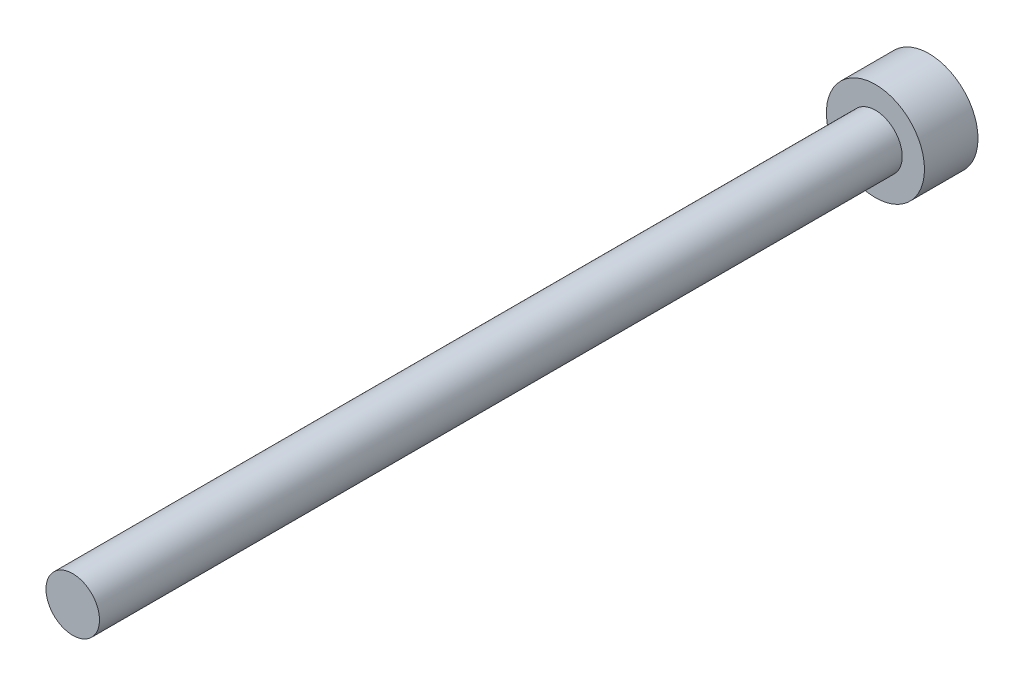
ISO-10303-21;
HEADER;
FILE_DESCRIPTION(('STEP AP214'),'2;1');
FILE_NAME('part.step','',(''),(''),'','','');
FILE_SCHEMA(('AUTOMOTIVE_DESIGN { 1 0 10303 214 1 1 1 1 }'));
ENDSEC;
DATA;
#1=APPLICATION_CONTEXT('core data for automotive mechanical design processes');
#2=APPLICATION_PROTOCOL_DEFINITION('international standard','automotive_design',2000,#1);
#3=PRODUCT_CONTEXT('',#1,'mechanical');
#4=PRODUCT('Part','Part','',(#3));
#5=PRODUCT_RELATED_PRODUCT_CATEGORY('part','',(#4));
#6=PRODUCT_DEFINITION_FORMATION('','',#4);
#7=PRODUCT_DEFINITION_CONTEXT('part definition',#1,'design');
#8=PRODUCT_DEFINITION('design','',#6,#7);
#9=PRODUCT_DEFINITION_SHAPE('','',#8);
#10=(LENGTH_UNIT() NAMED_UNIT(*) SI_UNIT(.MILLI.,.METRE.));
#11=(NAMED_UNIT(*) PLANE_ANGLE_UNIT() SI_UNIT($,.RADIAN.));
#12=(NAMED_UNIT(*) SI_UNIT($,.STERADIAN.) SOLID_ANGLE_UNIT());
#13=UNCERTAINTY_MEASURE_WITH_UNIT(LENGTH_MEASURE(1.E-05),#10,'distance_accuracy_value','');
#14=(GEOMETRIC_REPRESENTATION_CONTEXT(3) GLOBAL_UNCERTAINTY_ASSIGNED_CONTEXT((#13)) GLOBAL_UNIT_ASSIGNED_CONTEXT((#10,
#11,#12)) REPRESENTATION_CONTEXT('',''));
#15=CARTESIAN_POINT('',(0.,0.,0.));
#16=DIRECTION('',(0.,0.,1.));
#17=DIRECTION('',(1.,0.,0.));
#18=AXIS2_PLACEMENT_3D('',#15,#16,#17);
#19=CARTESIAN_POINT('',(0.,0.,-3.));
#20=DIRECTION('',(0.,0.,1.));
#21=DIRECTION('',(1.,0.,0.));
#22=AXIS2_PLACEMENT_3D('',#19,#20,#21);
#23=PLANE('',#22);
#24=CARTESIAN_POINT('',(0.,0.,-3.));
#25=DIRECTION('',(0.,0.,1.));
#26=DIRECTION('',(1.,0.,0.));
#27=AXIS2_PLACEMENT_3D('',#24,#25,#26);
#28=CIRCLE('',#27,2.75);
#29=CARTESIAN_POINT('',(2.75,0.,-3.));
#30=VERTEX_POINT('',#29);
#31=EDGE_CURVE('E112',#30,#30,#28,.T.);
#32=ORIENTED_EDGE('',*,*,#31,.F.);
#33=EDGE_LOOP('',(#32));
#34=FACE_BOUND('',#33,.T.);
#35=DIRECTION('',(-0.5,-0.866025403784439,0.));
#36=VECTOR('',#35,1.);
#37=CARTESIAN_POINT('',(1.08253175473055,-0.625,-3.));
#38=LINE('',#37,#36);
#39=CARTESIAN_POINT('',(1.44337567297406,0.,-3.));
#40=VERTEX_POINT('',#39);
#41=CARTESIAN_POINT('',(0.721687836487032,-1.25,-3.));
#42=VERTEX_POINT('',#41);
#43=EDGE_CURVE('E11',#40,#42,#38,.T.);
#44=ORIENTED_EDGE('',*,*,#43,.F.);
#45=DIRECTION('',(0.5,-0.866025403784439,0.));
#46=VECTOR('',#45,1.);
#47=CARTESIAN_POINT('',(1.08253175473055,0.625,-3.));
#48=LINE('',#47,#46);
#49=CARTESIAN_POINT('',(0.721687836487032,1.25,-3.));
#50=VERTEX_POINT('',#49);
#51=EDGE_CURVE('E50',#50,#40,#48,.T.);
#52=ORIENTED_EDGE('',*,*,#51,.F.);
#53=DIRECTION('',(1.,0.,0.));
#54=VECTOR('',#53,1.);
#55=CARTESIAN_POINT('',(0.,1.25,-3.));
#56=LINE('',#55,#54);
#57=CARTESIAN_POINT('',(-0.721687836487032,1.25,-3.));
#58=VERTEX_POINT('',#57);
#59=EDGE_CURVE('E133',#58,#50,#56,.T.);
#60=ORIENTED_EDGE('',*,*,#59,.F.);
#61=DIRECTION('',(0.5,0.866025403784439,0.));
#62=VECTOR('',#61,1.);
#63=CARTESIAN_POINT('',(-1.08253175473055,0.625,-3.));
#64=LINE('',#63,#62);
#65=CARTESIAN_POINT('',(-1.44337567297406,0.,-3.));
#66=VERTEX_POINT('',#65);
#67=EDGE_CURVE('E129',#66,#58,#64,.T.);
#68=ORIENTED_EDGE('',*,*,#67,.F.);
#69=DIRECTION('',(-0.5,0.866025403784439,0.));
#70=VECTOR('',#69,1.);
#71=CARTESIAN_POINT('',(-1.08253175473055,-0.624999999999999,-3.));
#72=LINE('',#71,#70);
#73=CARTESIAN_POINT('',(-0.721687836487033,-1.25,-3.));
#74=VERTEX_POINT('',#73);
#75=EDGE_CURVE('E130',#74,#66,#72,.T.);
#76=ORIENTED_EDGE('',*,*,#75,.F.);
#77=DIRECTION('',(-1.,0.,0.));
#78=VECTOR('',#77,1.);
#79=CARTESIAN_POINT('',(0.,-1.25,-3.));
#80=LINE('',#79,#78);
#81=EDGE_CURVE('E116',#42,#74,#80,.T.);
#82=ORIENTED_EDGE('',*,*,#81,.F.);
#83=EDGE_LOOP('',(#44,#52,#60,#68,#76,#82));
#84=FACE_BOUND('',#83,.T.);
#85=ADVANCED_FACE('F39',(#34,#84),#23,.F.);
#86=CARTESIAN_POINT('',(0.,0.,0.));
#87=DIRECTION('',(0.,0.,-1.));
#88=DIRECTION('',(-1.,0.,0.));
#89=AXIS2_PLACEMENT_3D('',#86,#87,#88);
#90=CYLINDRICAL_SURFACE('',#89,2.75);
#91=CARTESIAN_POINT('',(0.,0.,0.));
#92=DIRECTION('',(0.,0.,1.));
#93=DIRECTION('',(1.,0.,0.));
#94=AXIS2_PLACEMENT_3D('',#91,#92,#93);
#95=CIRCLE('',#94,2.75);
#96=CARTESIAN_POINT('',(2.75,0.,0.));
#97=VERTEX_POINT('',#96);
#98=EDGE_CURVE('E121',#97,#97,#95,.T.);
#99=ORIENTED_EDGE('',*,*,#98,.F.);
#100=EDGE_LOOP('',(#99));
#101=FACE_BOUND('',#100,.T.);
#102=ORIENTED_EDGE('',*,*,#31,.T.);
#103=EDGE_LOOP('',(#102));
#104=FACE_BOUND('',#103,.T.);
#105=ADVANCED_FACE('F41',(#101,#104),#90,.T.);
#106=CARTESIAN_POINT('',(0.,0.,0.));
#107=DIRECTION('',(0.,0.,1.));
#108=DIRECTION('',(1.,0.,0.));
#109=AXIS2_PLACEMENT_3D('',#106,#107,#108);
#110=PLANE('',#109);
#111=CARTESIAN_POINT('',(0.,0.,0.));
#112=DIRECTION('',(0.,0.,1.));
#113=DIRECTION('',(1.,0.,0.));
#114=AXIS2_PLACEMENT_3D('',#111,#112,#113);
#115=CIRCLE('',#114,1.5);
#116=CARTESIAN_POINT('',(-1.5,0.,0.));
#117=VERTEX_POINT('',#116);
#118=EDGE_CURVE('E119',#117,#117,#115,.T.);
#119=ORIENTED_EDGE('',*,*,#118,.F.);
#120=EDGE_LOOP('',(#119));
#121=FACE_BOUND('',#120,.T.);
#122=ORIENTED_EDGE('',*,*,#98,.T.);
#123=EDGE_LOOP('',(#122));
#124=FACE_BOUND('',#123,.T.);
#125=ADVANCED_FACE('F177',(#121,#124),#110,.T.);
#126=CARTESIAN_POINT('',(0.,0.,45.));
#127=DIRECTION('',(0.,0.,-1.));
#128=DIRECTION('',(-1.,0.,0.));
#129=AXIS2_PLACEMENT_3D('',#126,#127,#128);
#130=CYLINDRICAL_SURFACE('',#129,1.5);
#131=CARTESIAN_POINT('',(0.,0.,45.));
#132=DIRECTION('',(0.,0.,1.));
#133=DIRECTION('',(1.,0.,0.));
#134=AXIS2_PLACEMENT_3D('',#131,#132,#133);
#135=CIRCLE('',#134,1.5);
#136=CARTESIAN_POINT('',(-1.5,0.,45.));
#137=VERTEX_POINT('',#136);
#138=EDGE_CURVE('E110',#137,#137,#135,.T.);
#139=CARTESIAN_POINT('',(-1.5,0.,45.));
#140=CARTESIAN_POINT('',(-1.5,0.,44.53125));
#141=CARTESIAN_POINT('',(-1.5,0.,44.0625));
#142=CARTESIAN_POINT('',(-1.5,0.,43.125));
#143=CARTESIAN_POINT('',(-1.5,0.,42.65625));
#144=CARTESIAN_POINT('',(-1.5,0.,41.71875));
#145=CARTESIAN_POINT('',(-1.5,0.,41.25));
#146=CARTESIAN_POINT('',(-1.5,0.,40.3125));
#147=CARTESIAN_POINT('',(-1.5,0.,39.84375));
#148=CARTESIAN_POINT('',(-1.5,0.,38.90625));
#149=CARTESIAN_POINT('',(-1.5,0.,38.4375));
#150=CARTESIAN_POINT('',(-1.5,0.,37.5));
#151=CARTESIAN_POINT('',(-1.5,0.,37.03125));
#152=CARTESIAN_POINT('',(-1.5,0.,36.09375));
#153=CARTESIAN_POINT('',(-1.5,0.,35.625));
#154=CARTESIAN_POINT('',(-1.5,0.,34.6875));
#155=CARTESIAN_POINT('',(-1.5,0.,34.21875));
#156=CARTESIAN_POINT('',(-1.5,0.,33.28125));
#157=CARTESIAN_POINT('',(-1.5,0.,32.8125));
#158=CARTESIAN_POINT('',(-1.5,0.,31.875));
#159=CARTESIAN_POINT('',(-1.5,0.,31.40625));
#160=CARTESIAN_POINT('',(-1.5,0.,30.46875));
#161=CARTESIAN_POINT('',(-1.5,0.,30.));
#162=CARTESIAN_POINT('',(-1.5,0.,29.0625));
#163=CARTESIAN_POINT('',(-1.5,0.,28.59375));
#164=CARTESIAN_POINT('',(-1.5,0.,27.65625));
#165=CARTESIAN_POINT('',(-1.5,0.,27.1875));
#166=CARTESIAN_POINT('',(-1.5,0.,26.25));
#167=CARTESIAN_POINT('',(-1.5,0.,25.78125));
#168=CARTESIAN_POINT('',(-1.5,0.,24.84375));
#169=CARTESIAN_POINT('',(-1.5,0.,24.375));
#170=CARTESIAN_POINT('',(-1.5,0.,23.4375));
#171=CARTESIAN_POINT('',(-1.5,0.,22.96875));
#172=CARTESIAN_POINT('',(-1.5,0.,22.03125));
#173=CARTESIAN_POINT('',(-1.5,0.,21.5625));
#174=CARTESIAN_POINT('',(-1.5,0.,20.625));
#175=CARTESIAN_POINT('',(-1.5,0.,20.15625));
#176=CARTESIAN_POINT('',(-1.5,0.,19.21875));
#177=CARTESIAN_POINT('',(-1.5,0.,18.75));
#178=CARTESIAN_POINT('',(-1.5,0.,17.8125));
#179=CARTESIAN_POINT('',(-1.5,0.,17.34375));
#180=CARTESIAN_POINT('',(-1.5,0.,16.40625));
#181=CARTESIAN_POINT('',(-1.5,0.,15.9375));
#182=CARTESIAN_POINT('',(-1.5,0.,15.));
#183=CARTESIAN_POINT('',(-1.5,0.,14.53125));
#184=CARTESIAN_POINT('',(-1.5,0.,13.59375));
#185=CARTESIAN_POINT('',(-1.5,0.,13.125));
#186=CARTESIAN_POINT('',(-1.5,0.,12.1875));
#187=CARTESIAN_POINT('',(-1.5,0.,11.71875));
#188=CARTESIAN_POINT('',(-1.5,0.,10.78125));
#189=CARTESIAN_POINT('',(-1.5,0.,10.3125));
#190=CARTESIAN_POINT('',(-1.5,0.,9.37499999999999));
#191=CARTESIAN_POINT('',(-1.5,0.,8.90624999999999));
#192=CARTESIAN_POINT('',(-1.5,0.,7.96874999999999));
#193=CARTESIAN_POINT('',(-1.5,0.,7.5));
#194=CARTESIAN_POINT('',(-1.5,0.,6.56249999999999));
#195=CARTESIAN_POINT('',(-1.5,0.,6.09374999999999));
#196=CARTESIAN_POINT('',(-1.5,0.,5.15624999999999));
#197=CARTESIAN_POINT('',(-1.5,0.,4.68749999999999));
#198=CARTESIAN_POINT('',(-1.5,0.,3.74999999999999));
#199=CARTESIAN_POINT('',(-1.5,0.,3.28124999999999));
#200=CARTESIAN_POINT('',(-1.5,0.,2.34374999999999));
#201=CARTESIAN_POINT('',(-1.5,0.,1.87499999999999));
#202=CARTESIAN_POINT('',(-1.5,0.,0.937499999999992));
#203=CARTESIAN_POINT('',(-1.5,0.,0.468749999999993));
#204=CARTESIAN_POINT('',(-1.5,0.,0.));
#205=B_SPLINE_CURVE_WITH_KNOTS('',3,(#139,#140,#141,#142,#143,#144,#145,#146,#147,#148,#149,
#150,#151,#152,#153,#154,#155,#156,#157,#158,#159,#160,#161,#162,#163,#164,#165,#166,#167,#168,
#169,#170,#171,#172,#173,#174,#175,#176,#177,#178,#179,#180,#181,#182,#183,#184,#185,#186,#187,
#188,#189,#190,#191,#192,#193,#194,#195,#196,#197,#198,#199,#200,#201,#202,#203,#204),
.UNSPECIFIED.,.F.,.F.,(4,2,2,2,2,2,2,2,2,2,2,2,2,2,2,2,2,2,2,2,2,2,2,2,2,2,2,2,2,2,2,2,4),(0.,
1.40625,2.8125,4.21874999999999,5.625,7.03125,8.43749999999999,9.84375,11.25,12.65625,14.0625,
15.46875,16.875,18.28125,19.6875,21.09375,22.5,23.90625,25.3125,26.71875,28.125,29.53125,
30.9375,32.34375,33.75,35.15625,36.5625,37.96875,39.375,40.78125,42.1875,43.59375,45.),.UNSPECIFIED.);
#206=EDGE_CURVE('BSEAM184',#137,#117,#205,.T.);
#207=ORIENTED_EDGE('',*,*,#138,.F.);
#208=ORIENTED_EDGE('',*,*,#118,.T.);
#209=ORIENTED_EDGE('',*,*,#206,.T.);
#210=ORIENTED_EDGE('',*,*,#206,.F.);
#211=EDGE_LOOP('',(#207,#209,#208,#210));
#212=FACE_BOUND('',#211,.T.);
#213=ADVANCED_FACE('F184',(#212),#130,.T.);
#214=CARTESIAN_POINT('',(0.,0.,45.));
#215=DIRECTION('',(0.,0.,1.));
#216=DIRECTION('',(1.,0.,0.));
#217=AXIS2_PLACEMENT_3D('',#214,#215,#216);
#218=PLANE('',#217);
#219=ORIENTED_EDGE('',*,*,#138,.T.);
#220=EDGE_LOOP('',(#219));
#221=FACE_BOUND('',#220,.T.);
#222=ADVANCED_FACE('F187',(#221),#218,.T.);
#223=CARTESIAN_POINT('',(0.721687836487032,-1.25,-1.35));
#224=DIRECTION('',(-0.866025403784439,0.5,0.));
#225=DIRECTION('',(-0.5,-0.866025403784439,0.));
#226=AXIS2_PLACEMENT_3D('',#223,#224,#225);
#227=PLANE('',#226);
#228=ORIENTED_EDGE('',*,*,#43,.T.);
#229=DIRECTION('',(0.,0.,-1.));
#230=VECTOR('',#229,1.);
#231=CARTESIAN_POINT('',(0.721687836487032,-1.25,-1.35));
#232=LINE('',#231,#230);
#233=CARTESIAN_POINT('',(0.721687836487032,-1.25,-1.35));
#234=VERTEX_POINT('',#233);
#235=EDGE_CURVE('E53',#234,#42,#232,.T.);
#236=ORIENTED_EDGE('',*,*,#235,.F.);
#237=DIRECTION('',(0.5,0.866025403784439,0.));
#238=VECTOR('',#237,1.);
#239=CARTESIAN_POINT('',(0.721687836487032,-1.25,-1.35));
#240=LINE('',#239,#238);
#241=CARTESIAN_POINT('',(1.44337567297406,0.,-1.35));
#242=VERTEX_POINT('',#241);
#243=EDGE_CURVE('E96',#234,#242,#240,.T.);
#244=ORIENTED_EDGE('',*,*,#243,.T.);
#245=DIRECTION('',(0.,0.,-1.));
#246=VECTOR('',#245,1.);
#247=CARTESIAN_POINT('',(1.44337567297406,0.,-1.35));
#248=LINE('',#247,#246);
#249=EDGE_CURVE('E103',#242,#40,#248,.T.);
#250=ORIENTED_EDGE('',*,*,#249,.T.);
#251=EDGE_LOOP('',(#228,#236,#244,#250));
#252=FACE_BOUND('',#251,.T.);
#253=ADVANCED_FACE('F105',(#252),#227,.T.);
#254=CARTESIAN_POINT('',(1.44337567297406,0.,-1.35));
#255=DIRECTION('',(-0.866025403784439,-0.5,0.));
#256=DIRECTION('',(0.5,-0.866025403784439,0.));
#257=AXIS2_PLACEMENT_3D('',#254,#255,#256);
#258=PLANE('',#257);
#259=ORIENTED_EDGE('',*,*,#51,.T.);
#260=ORIENTED_EDGE('',*,*,#249,.F.);
#261=DIRECTION('',(-0.5,0.866025403784439,0.));
#262=VECTOR('',#261,1.);
#263=CARTESIAN_POINT('',(1.44337567297406,0.,-1.35));
#264=LINE('',#263,#262);
#265=CARTESIAN_POINT('',(0.721687836487032,1.25,-1.35));
#266=VERTEX_POINT('',#265);
#267=EDGE_CURVE('E95',#242,#266,#264,.T.);
#268=ORIENTED_EDGE('',*,*,#267,.T.);
#269=DIRECTION('',(0.,0.,-1.));
#270=VECTOR('',#269,1.);
#271=CARTESIAN_POINT('',(0.721687836487032,1.25,-1.35));
#272=LINE('',#271,#270);
#273=EDGE_CURVE('E107',#266,#50,#272,.T.);
#274=ORIENTED_EDGE('',*,*,#273,.T.);
#275=EDGE_LOOP('',(#259,#260,#268,#274));
#276=FACE_BOUND('',#275,.T.);
#277=ADVANCED_FACE('F106',(#276),#258,.T.);
#278=CARTESIAN_POINT('',(0.721687836487032,1.25,-1.35));
#279=DIRECTION('',(0.,-1.,0.));
#280=DIRECTION('',(1.,0.,0.));
#281=AXIS2_PLACEMENT_3D('',#278,#279,#280);
#282=PLANE('',#281);
#283=ORIENTED_EDGE('',*,*,#59,.T.);
#284=ORIENTED_EDGE('',*,*,#273,.F.);
#285=DIRECTION('',(-1.,0.,0.));
#286=VECTOR('',#285,1.);
#287=CARTESIAN_POINT('',(0.721687836487032,1.25,-1.35));
#288=LINE('',#287,#286);
#289=CARTESIAN_POINT('',(-0.721687836487032,1.25,-1.35));
#290=VERTEX_POINT('',#289);
#291=EDGE_CURVE('E98',#266,#290,#288,.T.);
#292=ORIENTED_EDGE('',*,*,#291,.T.);
#293=DIRECTION('',(0.,0.,-1.));
#294=VECTOR('',#293,1.);
#295=CARTESIAN_POINT('',(-0.721687836487032,1.25,-1.35));
#296=LINE('',#295,#294);
#297=EDGE_CURVE('E114',#290,#58,#296,.T.);
#298=ORIENTED_EDGE('',*,*,#297,.T.);
#299=EDGE_LOOP('',(#283,#284,#292,#298));
#300=FACE_BOUND('',#299,.T.);
#301=ADVANCED_FACE('F131',(#300),#282,.T.);
#302=CARTESIAN_POINT('',(-0.721687836487032,1.25,-1.35));
#303=DIRECTION('',(0.866025403784439,-0.5,0.));
#304=DIRECTION('',(0.5,0.866025403784439,0.));
#305=AXIS2_PLACEMENT_3D('',#302,#303,#304);
#306=PLANE('',#305);
#307=ORIENTED_EDGE('',*,*,#67,.T.);
#308=ORIENTED_EDGE('',*,*,#297,.F.);
#309=DIRECTION('',(-0.5,-0.866025403784439,0.));
#310=VECTOR('',#309,1.);
#311=CARTESIAN_POINT('',(-0.721687836487032,1.25,-1.35));
#312=LINE('',#311,#310);
#313=CARTESIAN_POINT('',(-1.44337567297406,0.,-1.35));
#314=VERTEX_POINT('',#313);
#315=EDGE_CURVE('E157',#290,#314,#312,.T.);
#316=ORIENTED_EDGE('',*,*,#315,.T.);
#317=DIRECTION('',(0.,0.,-1.));
#318=VECTOR('',#317,1.);
#319=CARTESIAN_POINT('',(-1.44337567297406,0.,-1.35));
#320=LINE('',#319,#318);
#321=EDGE_CURVE('E151',#314,#66,#320,.T.);
#322=ORIENTED_EDGE('',*,*,#321,.T.);
#323=EDGE_LOOP('',(#307,#308,#316,#322));
#324=FACE_BOUND('',#323,.T.);
#325=ADVANCED_FACE('F165',(#324),#306,.T.);
#326=CARTESIAN_POINT('',(-1.44337567297406,0.,-1.35));
#327=DIRECTION('',(0.866025403784439,0.5,0.));
#328=DIRECTION('',(-0.5,0.866025403784439,0.));
#329=AXIS2_PLACEMENT_3D('',#326,#327,#328);
#330=PLANE('',#329);
#331=ORIENTED_EDGE('',*,*,#75,.T.);
#332=ORIENTED_EDGE('',*,*,#321,.F.);
#333=DIRECTION('',(0.5,-0.866025403784439,0.));
#334=VECTOR('',#333,1.);
#335=CARTESIAN_POINT('',(-1.44337567297406,0.,-1.35));
#336=LINE('',#335,#334);
#337=CARTESIAN_POINT('',(-0.721687836487033,-1.25,-1.35));
#338=VERTEX_POINT('',#337);
#339=EDGE_CURVE('E147',#314,#338,#336,.T.);
#340=ORIENTED_EDGE('',*,*,#339,.T.);
#341=DIRECTION('',(0.,0.,-1.));
#342=VECTOR('',#341,1.);
#343=CARTESIAN_POINT('',(-0.721687836487033,-1.25,-1.35));
#344=LINE('',#343,#342);
#345=EDGE_CURVE('E145',#338,#74,#344,.T.);
#346=ORIENTED_EDGE('',*,*,#345,.T.);
#347=EDGE_LOOP('',(#331,#332,#340,#346));
#348=FACE_BOUND('',#347,.T.);
#349=ADVANCED_FACE('F148',(#348),#330,.T.);
#350=CARTESIAN_POINT('',(-0.721687836487033,-1.25,-1.35));
#351=DIRECTION('',(0.,1.,0.));
#352=DIRECTION('',(-1.,0.,0.));
#353=AXIS2_PLACEMENT_3D('',#350,#351,#352);
#354=PLANE('',#353);
#355=ORIENTED_EDGE('',*,*,#81,.T.);
#356=ORIENTED_EDGE('',*,*,#345,.F.);
#357=DIRECTION('',(1.,0.,0.));
#358=VECTOR('',#357,1.);
#359=CARTESIAN_POINT('',(-0.721687836487033,-1.25,-1.35));
#360=LINE('',#359,#358);
#361=EDGE_CURVE('E152',#338,#234,#360,.T.);
#362=ORIENTED_EDGE('',*,*,#361,.T.);
#363=ORIENTED_EDGE('',*,*,#235,.T.);
#364=EDGE_LOOP('',(#355,#356,#362,#363));
#365=FACE_BOUND('',#364,.T.);
#366=ADVANCED_FACE('F141',(#365),#354,.T.);
#367=CARTESIAN_POINT('',(0.,0.,-1.35));
#368=DIRECTION('',(0.,0.,1.));
#369=DIRECTION('',(1.,0.,0.));
#370=AXIS2_PLACEMENT_3D('',#367,#368,#369);
#371=PLANE('',#370);
#372=ORIENTED_EDGE('',*,*,#243,.F.);
#373=ORIENTED_EDGE('',*,*,#361,.F.);
#374=ORIENTED_EDGE('',*,*,#339,.F.);
#375=ORIENTED_EDGE('',*,*,#315,.F.);
#376=ORIENTED_EDGE('',*,*,#291,.F.);
#377=ORIENTED_EDGE('',*,*,#267,.F.);
#378=EDGE_LOOP('',(#372,#373,#374,#375,#376,#377));
#379=FACE_BOUND('',#378,.T.);
#380=ADVANCED_FACE('F94',(#379),#371,.F.);
#381=CLOSED_SHELL('',(#85,#105,#125,#213,#222,#253,#277,#301,#325,#349,#366,#380));
#382=MANIFOLD_SOLID_BREP('B2',#381);
#383=ADVANCED_BREP_SHAPE_REPRESENTATION('',(#18,#382),#14);
#384=SHAPE_DEFINITION_REPRESENTATION(#9,#383);
ENDSEC;
END-ISO-10303-21;
